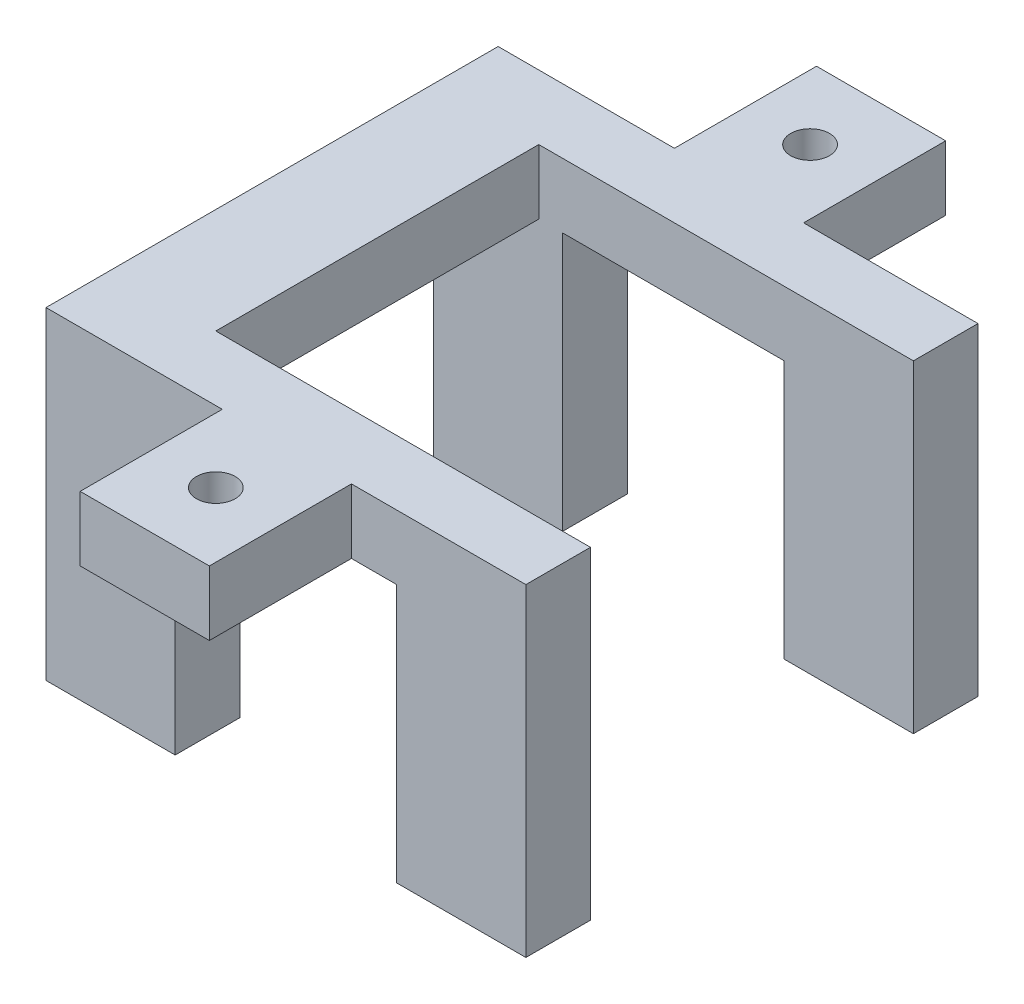
ISO-10303-21;
HEADER;
FILE_DESCRIPTION(('STEP AP214'),'2;1');
FILE_NAME('part.step','',(''),(''),'','','');
FILE_SCHEMA(('AUTOMOTIVE_DESIGN { 1 0 10303 214 1 1 1 1 }'));
ENDSEC;
DATA;
#1=APPLICATION_CONTEXT('core data for automotive mechanical design processes');
#2=APPLICATION_PROTOCOL_DEFINITION('international standard','automotive_design',2000,#1);
#3=PRODUCT_CONTEXT('',#1,'mechanical');
#4=PRODUCT('Part','Part','',(#3));
#5=PRODUCT_RELATED_PRODUCT_CATEGORY('part','',(#4));
#6=PRODUCT_DEFINITION_FORMATION('','',#4);
#7=PRODUCT_DEFINITION_CONTEXT('part definition',#1,'design');
#8=PRODUCT_DEFINITION('design','',#6,#7);
#9=PRODUCT_DEFINITION_SHAPE('','',#8);
#10=(LENGTH_UNIT() NAMED_UNIT(*) SI_UNIT(.MILLI.,.METRE.));
#11=(NAMED_UNIT(*) PLANE_ANGLE_UNIT() SI_UNIT($,.RADIAN.));
#12=(NAMED_UNIT(*) SI_UNIT($,.STERADIAN.) SOLID_ANGLE_UNIT());
#13=UNCERTAINTY_MEASURE_WITH_UNIT(LENGTH_MEASURE(1.E-05),#10,'distance_accuracy_value','');
#14=(GEOMETRIC_REPRESENTATION_CONTEXT(3) GLOBAL_UNCERTAINTY_ASSIGNED_CONTEXT((#13)) GLOBAL_UNIT_ASSIGNED_CONTEXT((#10,
#11,#12)) REPRESENTATION_CONTEXT('',''));
#15=CARTESIAN_POINT('',(0.,0.,0.));
#16=DIRECTION('',(0.,0.,1.));
#17=DIRECTION('',(1.,0.,0.));
#18=AXIS2_PLACEMENT_3D('',#15,#16,#17);
#19=CARTESIAN_POINT('',(0.,0.,0.));
#20=DIRECTION('',(0.,1.,0.));
#21=DIRECTION('',(0.,0.,1.));
#22=AXIS2_PLACEMENT_3D('',#19,#20,#21);
#23=PLANE('',#22);
#24=DIRECTION('',(1.,0.,0.));
#25=VECTOR('',#24,1.);
#26=CARTESIAN_POINT('',(0.,0.,12.5));
#27=LINE('',#26,#25);
#28=CARTESIAN_POINT('',(-2.6448064881758,0.,12.5));
#29=VERTEX_POINT('',#28);
#30=CARTESIAN_POINT('',(5.5,0.,12.5));
#31=VERTEX_POINT('',#30);
#32=EDGE_CURVE('E269',#29,#31,#27,.T.);
#33=ORIENTED_EDGE('',*,*,#32,.F.);
#34=DIRECTION('',(0.,0.,-1.));
#35=VECTOR('',#34,1.);
#36=CARTESIAN_POINT('',(-2.6448064881758,0.,17.5));
#37=LINE('',#36,#35);
#38=CARTESIAN_POINT('',(-2.6448064881758,0.,-12.5));
#39=VERTEX_POINT('',#38);
#40=EDGE_CURVE('E234',#29,#39,#37,.T.);
#41=ORIENTED_EDGE('',*,*,#40,.T.);
#42=DIRECTION('',(-1.,0.,0.));
#43=VECTOR('',#42,1.);
#44=CARTESIAN_POINT('',(0.,0.,-12.5));
#45=LINE('',#44,#43);
#46=CARTESIAN_POINT('',(5.5,0.,-12.5));
#47=VERTEX_POINT('',#46);
#48=EDGE_CURVE('E271',#47,#39,#45,.T.);
#49=ORIENTED_EDGE('',*,*,#48,.F.);
#50=DIRECTION('',(0.,0.,1.));
#51=VECTOR('',#50,1.);
#52=CARTESIAN_POINT('',(5.5,0.,-8.5));
#53=LINE('',#52,#51);
#54=EDGE_CURVE('E261',#47,#31,#53,.T.);
#55=ORIENTED_EDGE('',*,*,#54,.T.);
#56=EDGE_LOOP('',(#33,#41,#49,#55));
#57=FACE_BOUND('',#56,.T.);
#58=ADVANCED_FACE('F36',(#57),#23,.F.);
#59=CARTESIAN_POINT('',(16.,0.,-23.));
#60=DIRECTION('',(0.,1.,0.));
#61=DIRECTION('',(0.,0.,1.));
#62=AXIS2_PLACEMENT_3D('',#59,#60,#61);
#63=CIRCLE('',#62,1.5);
#64=CARTESIAN_POINT('',(16.,0.,-21.5));
#65=VERTEX_POINT('',#64);
#66=EDGE_CURVE('E316',#65,#65,#63,.T.);
#67=ORIENTED_EDGE('',*,*,#66,.T.);
#68=EDGE_LOOP('',(#67));
#69=FACE_BOUND('',#68,.T.);
#70=DIRECTION('',(0.,0.,1.));
#71=VECTOR('',#70,1.);
#72=CARTESIAN_POINT('',(7.3551935118242,0.,0.));
#73=LINE('',#72,#71);
#74=CARTESIAN_POINT('',(7.3551935118242,0.,-17.5));
#75=VERTEX_POINT('',#74);
#76=CARTESIAN_POINT('',(7.3551935118242,0.,-12.5));
#77=VERTEX_POINT('',#76);
#78=EDGE_CURVE('E454',#75,#77,#73,.T.);
#79=ORIENTED_EDGE('',*,*,#78,.F.);
#80=DIRECTION('',(-1.,0.,0.));
#81=VECTOR('',#80,1.);
#82=CARTESIAN_POINT('',(16.5,0.,-17.5));
#83=LINE('',#82,#81);
#84=CARTESIAN_POINT('',(11.,0.,-17.5));
#85=VERTEX_POINT('',#84);
#86=EDGE_CURVE('E363',#85,#75,#83,.T.);
#87=ORIENTED_EDGE('',*,*,#86,.F.);
#88=DIRECTION('',(0.,0.,1.));
#89=VECTOR('',#88,1.);
#90=CARTESIAN_POINT('',(11.,0.,-28.5));
#91=LINE('',#90,#89);
#92=CARTESIAN_POINT('',(11.,0.,-28.5));
#93=VERTEX_POINT('',#92);
#94=EDGE_CURVE('E341',#93,#85,#91,.T.);
#95=ORIENTED_EDGE('',*,*,#94,.F.);
#96=DIRECTION('',(-1.,0.,0.));
#97=VECTOR('',#96,1.);
#98=CARTESIAN_POINT('',(0.,0.,-28.5));
#99=LINE('',#98,#97);
#100=CARTESIAN_POINT('',(21.,0.,-28.5));
#101=VERTEX_POINT('',#100);
#102=EDGE_CURVE('E320',#101,#93,#99,.T.);
#103=ORIENTED_EDGE('',*,*,#102,.F.);
#104=DIRECTION('',(0.,0.,1.));
#105=VECTOR('',#104,1.);
#106=CARTESIAN_POINT('',(21.,0.,-28.5));
#107=LINE('',#106,#105);
#108=CARTESIAN_POINT('',(21.,0.,-17.5));
#109=VERTEX_POINT('',#108);
#110=EDGE_CURVE('E330',#101,#109,#107,.T.);
#111=ORIENTED_EDGE('',*,*,#110,.T.);
#112=DIRECTION('',(-1.,0.,0.));
#113=VECTOR('',#112,1.);
#114=CARTESIAN_POINT('',(0.,0.,-17.5));
#115=LINE('',#114,#113);
#116=CARTESIAN_POINT('',(24.5,0.,-17.5));
#117=VERTEX_POINT('',#116);
#118=EDGE_CURVE('E304',#117,#109,#115,.T.);
#119=ORIENTED_EDGE('',*,*,#118,.F.);
#120=DIRECTION('',(0.,0.,1.));
#121=VECTOR('',#120,1.);
#122=CARTESIAN_POINT('',(24.5,0.,-19.5));
#123=LINE('',#122,#121);
#124=CARTESIAN_POINT('',(24.5,0.,-12.5));
#125=VERTEX_POINT('',#124);
#126=EDGE_CURVE('E310',#117,#125,#123,.T.);
#127=ORIENTED_EDGE('',*,*,#126,.T.);
#128=DIRECTION('',(1.,0.,0.));
#129=VECTOR('',#128,1.);
#130=CARTESIAN_POINT('',(5.5,0.,-12.5));
#131=LINE('',#130,#129);
#132=EDGE_CURVE('E349',#77,#125,#131,.T.);
#133=ORIENTED_EDGE('',*,*,#132,.F.);
#134=EDGE_LOOP('',(#79,#87,#95,#103,#111,#119,#127,#133));
#135=FACE_BOUND('',#134,.T.);
#136=ADVANCED_FACE('F421',(#69,#135),#23,.F.);
#137=CARTESIAN_POINT('',(0.,0.,-17.5));
#138=DIRECTION('',(0.,0.,-1.));
#139=DIRECTION('',(-1.,0.,0.));
#140=AXIS2_PLACEMENT_3D('',#137,#138,#139);
#141=PLANE('',#140);
#142=DIRECTION('',(0.,1.,0.));
#143=VECTOR('',#142,1.);
#144=CARTESIAN_POINT('',(24.5,0.,-17.5));
#145=LINE('',#144,#143);
#146=CARTESIAN_POINT('',(24.5,-20.,-17.5));
#147=VERTEX_POINT('',#146);
#148=EDGE_CURVE('E303',#147,#117,#145,.T.);
#149=ORIENTED_EDGE('',*,*,#148,.T.);
#150=ORIENTED_EDGE('',*,*,#118,.T.);
#151=DIRECTION('',(0.,-1.,0.));
#152=VECTOR('',#151,1.);
#153=CARTESIAN_POINT('',(21.,0.,-17.5));
#154=LINE('',#153,#152);
#155=CARTESIAN_POINT('',(21.,5.,-17.5));
#156=VERTEX_POINT('',#155);
#157=EDGE_CURVE('E324',#156,#109,#154,.T.);
#158=ORIENTED_EDGE('',*,*,#157,.F.);
#159=DIRECTION('',(1.,0.,0.));
#160=VECTOR('',#159,1.);
#161=CARTESIAN_POINT('',(-5.5,5.,-17.5));
#162=LINE('',#161,#160);
#163=CARTESIAN_POINT('',(34.5,5.,-17.5));
#164=VERTEX_POINT('',#163);
#165=EDGE_CURVE('E355',#156,#164,#162,.T.);
#166=ORIENTED_EDGE('',*,*,#165,.T.);
#167=DIRECTION('',(0.,-1.,0.));
#168=VECTOR('',#167,1.);
#169=CARTESIAN_POINT('',(34.5,5.,-17.5));
#170=LINE('',#169,#168);
#171=CARTESIAN_POINT('',(34.5,-20.,-17.5));
#172=VERTEX_POINT('',#171);
#173=EDGE_CURVE('E357',#164,#172,#170,.T.);
#174=ORIENTED_EDGE('',*,*,#173,.T.);
#175=DIRECTION('',(-1.,0.,0.));
#176=VECTOR('',#175,1.);
#177=CARTESIAN_POINT('',(34.5,-20.,-17.5));
#178=LINE('',#177,#176);
#179=EDGE_CURVE('E360',#172,#147,#178,.T.);
#180=ORIENTED_EDGE('',*,*,#179,.T.);
#181=EDGE_LOOP('',(#149,#150,#158,#166,#174,#180));
#182=FACE_BOUND('',#181,.T.);
#183=ADVANCED_FACE('F427',(#182),#141,.T.);
#184=CARTESIAN_POINT('',(0.,-20.,0.));
#185=DIRECTION('',(0.,-1.,0.));
#186=DIRECTION('',(0.,0.,-1.));
#187=AXIS2_PLACEMENT_3D('',#184,#185,#186);
#188=PLANE('',#187);
#189=DIRECTION('',(1.,0.,0.));
#190=VECTOR('',#189,1.);
#191=CARTESIAN_POINT('',(16.5,-20.,-12.5));
#192=LINE('',#191,#190);
#193=CARTESIAN_POINT('',(24.5,-20.,-12.5));
#194=VERTEX_POINT('',#193);
#195=CARTESIAN_POINT('',(34.5,-20.,-12.5));
#196=VERTEX_POINT('',#195);
#197=EDGE_CURVE('E351',#194,#196,#192,.T.);
#198=ORIENTED_EDGE('',*,*,#197,.F.);
#199=DIRECTION('',(0.,0.,1.));
#200=VECTOR('',#199,1.);
#201=CARTESIAN_POINT('',(24.5,-20.,-19.5));
#202=LINE('',#201,#200);
#203=EDGE_CURVE('E410',#147,#194,#202,.T.);
#204=ORIENTED_EDGE('',*,*,#203,.F.);
#205=ORIENTED_EDGE('',*,*,#179,.F.);
#206=DIRECTION('',(0.,0.,-1.));
#207=VECTOR('',#206,1.);
#208=CARTESIAN_POINT('',(34.5,-20.,-8.5));
#209=LINE('',#208,#207);
#210=EDGE_CURVE('E254',#196,#172,#209,.T.);
#211=ORIENTED_EDGE('',*,*,#210,.F.);
#212=EDGE_LOOP('',(#198,#204,#205,#211));
#213=FACE_BOUND('',#212,.T.);
#214=ADVANCED_FACE('F433',(#213),#188,.T.);
#215=CARTESIAN_POINT('',(0.,-20.,0.));
#216=DIRECTION('',(0.,-1.,0.));
#217=DIRECTION('',(0.,0.,-1.));
#218=AXIS2_PLACEMENT_3D('',#215,#216,#217);
#219=PLANE('',#218);
#220=DIRECTION('',(1.,0.,0.));
#221=VECTOR('',#220,1.);
#222=CARTESIAN_POINT('',(16.5,-20.,17.5));
#223=LINE('',#222,#221);
#224=CARTESIAN_POINT('',(24.5,-20.,17.5));
#225=VERTEX_POINT('',#224);
#226=CARTESIAN_POINT('',(34.5,-20.,17.5));
#227=VERTEX_POINT('',#226);
#228=EDGE_CURVE('E248',#225,#227,#223,.T.);
#229=ORIENTED_EDGE('',*,*,#228,.F.);
#230=CARTESIAN_POINT('',(24.5,-20.,12.5));
#231=VERTEX_POINT('',#230);
#232=EDGE_CURVE('E408',#231,#225,#202,.T.);
#233=ORIENTED_EDGE('',*,*,#232,.F.);
#234=DIRECTION('',(-1.,0.,0.));
#235=VECTOR('',#234,1.);
#236=CARTESIAN_POINT('',(34.5,-20.,12.5));
#237=LINE('',#236,#235);
#238=CARTESIAN_POINT('',(34.5,-20.,12.5));
#239=VERTEX_POINT('',#238);
#240=EDGE_CURVE('E288',#239,#231,#237,.T.);
#241=ORIENTED_EDGE('',*,*,#240,.F.);
#242=DIRECTION('',(0.,0.,1.));
#243=VECTOR('',#242,1.);
#244=CARTESIAN_POINT('',(34.5,-20.,8.5));
#245=LINE('',#244,#243);
#246=EDGE_CURVE('E256',#239,#227,#245,.T.);
#247=ORIENTED_EDGE('',*,*,#246,.T.);
#248=EDGE_LOOP('',(#229,#233,#241,#247));
#249=FACE_BOUND('',#248,.T.);
#250=ADVANCED_FACE('F407',(#249),#219,.T.);
#251=CARTESIAN_POINT('',(0.,0.,17.5));
#252=DIRECTION('',(0.,0.,1.));
#253=DIRECTION('',(1.,0.,0.));
#254=AXIS2_PLACEMENT_3D('',#251,#252,#253);
#255=PLANE('',#254);
#256=DIRECTION('',(0.,1.,0.));
#257=VECTOR('',#256,1.);
#258=CARTESIAN_POINT('',(21.,0.,17.5));
#259=LINE('',#258,#257);
#260=CARTESIAN_POINT('',(21.,0.,17.5));
#261=VERTEX_POINT('',#260);
#262=CARTESIAN_POINT('',(21.,5.,17.5));
#263=VERTEX_POINT('',#262);
#264=EDGE_CURVE('E372',#261,#263,#259,.T.);
#265=ORIENTED_EDGE('',*,*,#264,.F.);
#266=DIRECTION('',(1.,0.,0.));
#267=VECTOR('',#266,1.);
#268=CARTESIAN_POINT('',(16.5,0.,17.5));
#269=LINE('',#268,#267);
#270=CARTESIAN_POINT('',(24.5,0.,17.5));
#271=VERTEX_POINT('',#270);
#272=EDGE_CURVE('E400',#261,#271,#269,.T.);
#273=ORIENTED_EDGE('',*,*,#272,.T.);
#274=DIRECTION('',(0.,-1.,0.));
#275=VECTOR('',#274,1.);
#276=CARTESIAN_POINT('',(24.5,0.,17.5));
#277=LINE('',#276,#275);
#278=EDGE_CURVE('E411',#271,#225,#277,.T.);
#279=ORIENTED_EDGE('',*,*,#278,.T.);
#280=ORIENTED_EDGE('',*,*,#228,.T.);
#281=DIRECTION('',(0.,1.,0.));
#282=VECTOR('',#281,1.);
#283=CARTESIAN_POINT('',(34.5,-20.,17.5));
#284=LINE('',#283,#282);
#285=CARTESIAN_POINT('',(34.5,5.,17.5));
#286=VERTEX_POINT('',#285);
#287=EDGE_CURVE('E250',#227,#286,#284,.T.);
#288=ORIENTED_EDGE('',*,*,#287,.T.);
#289=DIRECTION('',(-1.,0.,0.));
#290=VECTOR('',#289,1.);
#291=CARTESIAN_POINT('',(34.5,5.,17.5));
#292=LINE('',#291,#290);
#293=EDGE_CURVE('E239',#286,#263,#292,.T.);
#294=ORIENTED_EDGE('',*,*,#293,.T.);
#295=EDGE_LOOP('',(#265,#273,#279,#280,#288,#294));
#296=FACE_BOUND('',#295,.T.);
#297=ADVANCED_FACE('F398',(#296),#255,.T.);
#298=CARTESIAN_POINT('',(0.,0.,12.5));
#299=DIRECTION('',(0.,0.,-1.));
#300=DIRECTION('',(-1.,0.,0.));
#301=AXIS2_PLACEMENT_3D('',#298,#299,#300);
#302=PLANE('',#301);
#303=DIRECTION('',(0.,1.,0.));
#304=VECTOR('',#303,1.);
#305=CARTESIAN_POINT('',(24.5,0.,12.5));
#306=LINE('',#305,#304);
#307=CARTESIAN_POINT('',(24.5,0.,12.5));
#308=VERTEX_POINT('',#307);
#309=EDGE_CURVE('E299',#231,#308,#306,.T.);
#310=ORIENTED_EDGE('',*,*,#309,.T.);
#311=DIRECTION('',(-1.,0.,0.));
#312=VECTOR('',#311,1.);
#313=CARTESIAN_POINT('',(16.5,0.,12.5));
#314=LINE('',#313,#312);
#315=CARTESIAN_POINT('',(7.3551935118242,0.,12.5));
#316=VERTEX_POINT('',#315);
#317=EDGE_CURVE('E58',#308,#316,#314,.T.);
#318=ORIENTED_EDGE('',*,*,#317,.T.);
#319=DIRECTION('',(0.,1.,0.));
#320=VECTOR('',#319,1.);
#321=CARTESIAN_POINT('',(7.3551935118242,-20.,12.5));
#322=LINE('',#321,#320);
#323=CARTESIAN_POINT('',(7.3551935118242,-20.,12.5));
#324=VERTEX_POINT('',#323);
#325=EDGE_CURVE('E297',#324,#316,#322,.T.);
#326=ORIENTED_EDGE('',*,*,#325,.F.);
#327=DIRECTION('',(1.,0.,0.));
#328=VECTOR('',#327,1.);
#329=CARTESIAN_POINT('',(0.,-20.,12.5));
#330=LINE('',#329,#328);
#331=CARTESIAN_POINT('',(-2.6448064881758,-20.,12.5));
#332=VERTEX_POINT('',#331);
#333=EDGE_CURVE('E462',#332,#324,#330,.T.);
#334=ORIENTED_EDGE('',*,*,#333,.F.);
#335=DIRECTION('',(0.,1.,0.));
#336=VECTOR('',#335,1.);
#337=CARTESIAN_POINT('',(-2.6448064881758,-20.,12.5));
#338=LINE('',#337,#336);
#339=EDGE_CURVE('E471',#332,#29,#338,.T.);
#340=ORIENTED_EDGE('',*,*,#339,.T.);
#341=ORIENTED_EDGE('',*,*,#32,.T.);
#342=DIRECTION('',(0.,1.,0.));
#343=VECTOR('',#342,1.);
#344=CARTESIAN_POINT('',(5.5,0.,12.5));
#345=LINE('',#344,#343);
#346=CARTESIAN_POINT('',(5.5,5.,12.5));
#347=VERTEX_POINT('',#346);
#348=EDGE_CURVE('E240',#31,#347,#345,.T.);
#349=ORIENTED_EDGE('',*,*,#348,.T.);
#350=DIRECTION('',(1.,0.,0.));
#351=VECTOR('',#350,1.);
#352=CARTESIAN_POINT('',(5.5,5.,12.5));
#353=LINE('',#352,#351);
#354=CARTESIAN_POINT('',(34.5,5.,12.5));
#355=VERTEX_POINT('',#354);
#356=EDGE_CURVE('E279',#347,#355,#353,.T.);
#357=ORIENTED_EDGE('',*,*,#356,.T.);
#358=DIRECTION('',(0.,-1.,0.));
#359=VECTOR('',#358,1.);
#360=CARTESIAN_POINT('',(34.5,5.,12.5));
#361=LINE('',#360,#359);
#362=EDGE_CURVE('E285',#355,#239,#361,.T.);
#363=ORIENTED_EDGE('',*,*,#362,.T.);
#364=ORIENTED_EDGE('',*,*,#240,.T.);
#365=EDGE_LOOP('',(#310,#318,#326,#334,#340,#341,#349,#357,#363,#364));
#366=FACE_BOUND('',#365,.T.);
#367=ADVANCED_FACE('F278',(#366),#302,.T.);
#368=CARTESIAN_POINT('',(0.,0.,-12.5));
#369=DIRECTION('',(0.,0.,1.));
#370=DIRECTION('',(1.,0.,0.));
#371=AXIS2_PLACEMENT_3D('',#368,#369,#370);
#372=PLANE('',#371);
#373=DIRECTION('',(0.,-1.,0.));
#374=VECTOR('',#373,1.);
#375=CARTESIAN_POINT('',(5.5,5.,-12.5));
#376=LINE('',#375,#374);
#377=CARTESIAN_POINT('',(5.5,5.,-12.5));
#378=VERTEX_POINT('',#377);
#379=EDGE_CURVE('E347',#378,#47,#376,.T.);
#380=ORIENTED_EDGE('',*,*,#379,.T.);
#381=ORIENTED_EDGE('',*,*,#48,.T.);
#382=DIRECTION('',(0.,1.,0.));
#383=VECTOR('',#382,1.);
#384=CARTESIAN_POINT('',(-2.6448064881758,-20.,-12.5));
#385=LINE('',#384,#383);
#386=CARTESIAN_POINT('',(-2.6448064881758,-20.,-12.5));
#387=VERTEX_POINT('',#386);
#388=EDGE_CURVE('E458',#387,#39,#385,.T.);
#389=ORIENTED_EDGE('',*,*,#388,.F.);
#390=DIRECTION('',(-1.,0.,0.));
#391=VECTOR('',#390,1.);
#392=CARTESIAN_POINT('',(0.,-20.,-12.5));
#393=LINE('',#392,#391);
#394=CARTESIAN_POINT('',(7.3551935118242,-20.,-12.5));
#395=VERTEX_POINT('',#394);
#396=EDGE_CURVE('E443',#395,#387,#393,.T.);
#397=ORIENTED_EDGE('',*,*,#396,.F.);
#398=DIRECTION('',(0.,1.,0.));
#399=VECTOR('',#398,1.);
#400=CARTESIAN_POINT('',(7.3551935118242,-20.,-12.5));
#401=LINE('',#400,#399);
#402=EDGE_CURVE('E440',#395,#77,#401,.T.);
#403=ORIENTED_EDGE('',*,*,#402,.T.);
#404=ORIENTED_EDGE('',*,*,#132,.T.);
#405=DIRECTION('',(0.,-1.,0.));
#406=VECTOR('',#405,1.);
#407=CARTESIAN_POINT('',(24.5,0.,-12.5));
#408=LINE('',#407,#406);
#409=EDGE_CURVE('E11',#125,#194,#408,.T.);
#410=ORIENTED_EDGE('',*,*,#409,.T.);
#411=ORIENTED_EDGE('',*,*,#197,.T.);
#412=DIRECTION('',(0.,1.,0.));
#413=VECTOR('',#412,1.);
#414=CARTESIAN_POINT('',(34.5,-20.,-12.5));
#415=LINE('',#414,#413);
#416=CARTESIAN_POINT('',(34.5,5.,-12.5));
#417=VERTEX_POINT('',#416);
#418=EDGE_CURVE('E353',#196,#417,#415,.T.);
#419=ORIENTED_EDGE('',*,*,#418,.T.);
#420=DIRECTION('',(-1.,0.,0.));
#421=VECTOR('',#420,1.);
#422=CARTESIAN_POINT('',(34.5,5.,-12.5));
#423=LINE('',#422,#421);
#424=EDGE_CURVE('E344',#417,#378,#423,.T.);
#425=ORIENTED_EDGE('',*,*,#424,.T.);
#426=EDGE_LOOP('',(#380,#381,#389,#397,#403,#404,#410,#411,#419,#425));
#427=FACE_BOUND('',#426,.T.);
#428=ADVANCED_FACE('F435',(#427),#372,.T.);
#429=CARTESIAN_POINT('',(34.5,-20.,-8.5));
#430=DIRECTION('',(1.,0.,0.));
#431=DIRECTION('',(0.,0.,-1.));
#432=AXIS2_PLACEMENT_3D('',#429,#430,#431);
#433=PLANE('',#432);
#434=DIRECTION('',(0.,0.,-1.));
#435=VECTOR('',#434,1.);
#436=CARTESIAN_POINT('',(34.5,5.,-8.5));
#437=LINE('',#436,#435);
#438=EDGE_CURVE('E253',#417,#164,#437,.T.);
#439=ORIENTED_EDGE('',*,*,#438,.F.);
#440=ORIENTED_EDGE('',*,*,#418,.F.);
#441=ORIENTED_EDGE('',*,*,#210,.T.);
#442=ORIENTED_EDGE('',*,*,#173,.F.);
#443=EDGE_LOOP('',(#439,#440,#441,#442));
#444=FACE_BOUND('',#443,.T.);
#445=ADVANCED_FACE('F538',(#444),#433,.T.);
#446=CARTESIAN_POINT('',(11.,5.,17.5));
#447=VERTEX_POINT('',#446);
#448=CARTESIAN_POINT('',(-2.6448064881758,5.,17.5));
#449=VERTEX_POINT('',#448);
#450=EDGE_CURVE('E230',#447,#449,#292,.T.);
#451=ORIENTED_EDGE('',*,*,#450,.T.);
#452=DIRECTION('',(0.,1.,0.));
#453=VECTOR('',#452,1.);
#454=CARTESIAN_POINT('',(-2.6448064881758,-20.,17.5));
#455=LINE('',#454,#453);
#456=CARTESIAN_POINT('',(-2.6448064881758,-20.,17.5));
#457=VERTEX_POINT('',#456);
#458=EDGE_CURVE('E210',#457,#449,#455,.T.);
#459=ORIENTED_EDGE('',*,*,#458,.F.);
#460=DIRECTION('',(-1.,0.,0.));
#461=VECTOR('',#460,1.);
#462=CARTESIAN_POINT('',(0.,-20.,17.5));
#463=LINE('',#462,#461);
#464=CARTESIAN_POINT('',(7.3551935118242,-20.,17.5));
#465=VERTEX_POINT('',#464);
#466=EDGE_CURVE('E223',#465,#457,#463,.T.);
#467=ORIENTED_EDGE('',*,*,#466,.F.);
#468=DIRECTION('',(0.,1.,0.));
#469=VECTOR('',#468,1.);
#470=CARTESIAN_POINT('',(7.3551935118242,-20.,17.5));
#471=LINE('',#470,#469);
#472=CARTESIAN_POINT('',(7.35519351182419,0.,17.5));
#473=VERTEX_POINT('',#472);
#474=EDGE_CURVE('E222',#465,#473,#471,.T.);
#475=ORIENTED_EDGE('',*,*,#474,.T.);
#476=DIRECTION('',(1.,0.,0.));
#477=VECTOR('',#476,1.);
#478=CARTESIAN_POINT('',(-5.5,0.,17.5));
#479=LINE('',#478,#477);
#480=CARTESIAN_POINT('',(11.,0.,17.5));
#481=VERTEX_POINT('',#480);
#482=EDGE_CURVE('E242',#473,#481,#479,.T.);
#483=ORIENTED_EDGE('',*,*,#482,.T.);
#484=DIRECTION('',(0.,-1.,0.));
#485=VECTOR('',#484,1.);
#486=CARTESIAN_POINT('',(11.,0.,17.5));
#487=LINE('',#486,#485);
#488=EDGE_CURVE('E238',#447,#481,#487,.T.);
#489=ORIENTED_EDGE('',*,*,#488,.F.);
#490=EDGE_LOOP('',(#451,#459,#467,#475,#483,#489));
#491=FACE_BOUND('',#490,.T.);
#492=ADVANCED_FACE('F236',(#491),#255,.T.);
#493=CARTESIAN_POINT('',(34.5,-20.,8.5));
#494=DIRECTION('',(1.,0.,0.));
#495=DIRECTION('',(0.,0.,-1.));
#496=AXIS2_PLACEMENT_3D('',#493,#494,#495);
#497=PLANE('',#496);
#498=ORIENTED_EDGE('',*,*,#246,.F.);
#499=ORIENTED_EDGE('',*,*,#362,.F.);
#500=DIRECTION('',(0.,0.,1.));
#501=VECTOR('',#500,1.);
#502=CARTESIAN_POINT('',(34.5,5.,8.5));
#503=LINE('',#502,#501);
#504=EDGE_CURVE('E259',#355,#286,#503,.T.);
#505=ORIENTED_EDGE('',*,*,#504,.T.);
#506=ORIENTED_EDGE('',*,*,#287,.F.);
#507=EDGE_LOOP('',(#498,#499,#505,#506));
#508=FACE_BOUND('',#507,.T.);
#509=ADVANCED_FACE('F405',(#508),#497,.T.);
#510=ORIENTED_EDGE('',*,*,#482,.F.);
#511=DIRECTION('',(0.,0.,-1.));
#512=VECTOR('',#511,1.);
#513=CARTESIAN_POINT('',(7.3551935118242,0.,0.));
#514=LINE('',#513,#512);
#515=EDGE_CURVE('E51',#473,#316,#514,.T.);
#516=ORIENTED_EDGE('',*,*,#515,.T.);
#517=ORIENTED_EDGE('',*,*,#317,.F.);
#518=EDGE_CURVE('E413',#308,#271,#123,.T.);
#519=ORIENTED_EDGE('',*,*,#518,.T.);
#520=ORIENTED_EDGE('',*,*,#272,.F.);
#521=DIRECTION('',(0.,0.,-1.));
#522=VECTOR('',#521,1.);
#523=CARTESIAN_POINT('',(21.,0.,28.5));
#524=LINE('',#523,#522);
#525=CARTESIAN_POINT('',(21.,0.,28.5));
#526=VERTEX_POINT('',#525);
#527=EDGE_CURVE('E286',#526,#261,#524,.T.);
#528=ORIENTED_EDGE('',*,*,#527,.F.);
#529=DIRECTION('',(1.,0.,0.));
#530=VECTOR('',#529,1.);
#531=CARTESIAN_POINT('',(0.,0.,28.5));
#532=LINE('',#531,#530);
#533=CARTESIAN_POINT('',(11.,0.,28.5));
#534=VERTEX_POINT('',#533);
#535=EDGE_CURVE('E373',#534,#526,#532,.T.);
#536=ORIENTED_EDGE('',*,*,#535,.F.);
#537=DIRECTION('',(0.,0.,-1.));
#538=VECTOR('',#537,1.);
#539=CARTESIAN_POINT('',(11.,0.,28.5));
#540=LINE('',#539,#538);
#541=EDGE_CURVE('E382',#534,#481,#540,.T.);
#542=ORIENTED_EDGE('',*,*,#541,.T.);
#543=EDGE_LOOP('',(#510,#516,#517,#519,#520,#528,#536,#542));
#544=FACE_BOUND('',#543,.T.);
#545=CARTESIAN_POINT('',(16.,0.,23.));
#546=DIRECTION('',(0.,1.,0.));
#547=DIRECTION('',(0.,0.,1.));
#548=AXIS2_PLACEMENT_3D('',#545,#546,#547);
#549=CIRCLE('',#548,1.5);
#550=CARTESIAN_POINT('',(16.,0.,24.5));
#551=VERTEX_POINT('',#550);
#552=EDGE_CURVE('E369',#551,#551,#549,.T.);
#553=ORIENTED_EDGE('',*,*,#552,.T.);
#554=EDGE_LOOP('',(#553));
#555=FACE_BOUND('',#554,.T.);
#556=ADVANCED_FACE('F497',(#544,#555),#23,.F.);
#557=CARTESIAN_POINT('',(5.5,5.,-8.5));
#558=DIRECTION('',(1.,0.,0.));
#559=DIRECTION('',(0.,0.,-1.));
#560=AXIS2_PLACEMENT_3D('',#557,#558,#559);
#561=PLANE('',#560);
#562=ORIENTED_EDGE('',*,*,#54,.F.);
#563=ORIENTED_EDGE('',*,*,#379,.F.);
#564=DIRECTION('',(0.,0.,-1.));
#565=VECTOR('',#564,1.);
#566=CARTESIAN_POINT('',(5.5,5.,8.5));
#567=LINE('',#566,#565);
#568=EDGE_CURVE('E44',#347,#378,#567,.T.);
#569=ORIENTED_EDGE('',*,*,#568,.F.);
#570=ORIENTED_EDGE('',*,*,#348,.F.);
#571=EDGE_LOOP('',(#562,#563,#569,#570));
#572=FACE_BOUND('',#571,.T.);
#573=ADVANCED_FACE('F38',(#572),#561,.T.);
#574=CARTESIAN_POINT('',(0.,5.,0.));
#575=DIRECTION('',(0.,1.,0.));
#576=DIRECTION('',(0.,0.,1.));
#577=AXIS2_PLACEMENT_3D('',#574,#575,#576);
#578=PLANE('',#577);
#579=DIRECTION('',(0.,0.,-1.));
#580=VECTOR('',#579,1.);
#581=CARTESIAN_POINT('',(-2.6448064881758,5.,17.5));
#582=LINE('',#581,#580);
#583=CARTESIAN_POINT('',(-2.6448064881758,5.,-17.5));
#584=VERTEX_POINT('',#583);
#585=EDGE_CURVE('E214',#449,#584,#582,.T.);
#586=ORIENTED_EDGE('',*,*,#585,.F.);
#587=ORIENTED_EDGE('',*,*,#450,.F.);
#588=DIRECTION('',(0.,0.,-1.));
#589=VECTOR('',#588,1.);
#590=CARTESIAN_POINT('',(11.,5.,28.5));
#591=LINE('',#590,#589);
#592=CARTESIAN_POINT('',(11.,5.,28.5));
#593=VERTEX_POINT('',#592);
#594=EDGE_CURVE('E388',#593,#447,#591,.T.);
#595=ORIENTED_EDGE('',*,*,#594,.F.);
#596=DIRECTION('',(-1.,0.,0.));
#597=VECTOR('',#596,1.);
#598=CARTESIAN_POINT('',(0.,5.,28.5));
#599=LINE('',#598,#597);
#600=CARTESIAN_POINT('',(21.,5.,28.5));
#601=VERTEX_POINT('',#600);
#602=EDGE_CURVE('E378',#601,#593,#599,.T.);
#603=ORIENTED_EDGE('',*,*,#602,.F.);
#604=DIRECTION('',(0.,0.,-1.));
#605=VECTOR('',#604,1.);
#606=CARTESIAN_POINT('',(21.,5.,28.5));
#607=LINE('',#606,#605);
#608=EDGE_CURVE('E291',#601,#263,#607,.T.);
#609=ORIENTED_EDGE('',*,*,#608,.T.);
#610=ORIENTED_EDGE('',*,*,#293,.F.);
#611=ORIENTED_EDGE('',*,*,#504,.F.);
#612=ORIENTED_EDGE('',*,*,#356,.F.);
#613=ORIENTED_EDGE('',*,*,#568,.T.);
#614=ORIENTED_EDGE('',*,*,#424,.F.);
#615=ORIENTED_EDGE('',*,*,#438,.T.);
#616=ORIENTED_EDGE('',*,*,#165,.F.);
#617=DIRECTION('',(0.,0.,1.));
#618=VECTOR('',#617,1.);
#619=CARTESIAN_POINT('',(21.,5.,-28.5));
#620=LINE('',#619,#618);
#621=CARTESIAN_POINT('',(21.,5.,-28.5));
#622=VERTEX_POINT('',#621);
#623=EDGE_CURVE('E336',#622,#156,#620,.T.);
#624=ORIENTED_EDGE('',*,*,#623,.F.);
#625=DIRECTION('',(1.,0.,0.));
#626=VECTOR('',#625,1.);
#627=CARTESIAN_POINT('',(0.,5.,-28.5));
#628=LINE('',#627,#626);
#629=CARTESIAN_POINT('',(11.,5.,-28.5));
#630=VERTEX_POINT('',#629);
#631=EDGE_CURVE('E326',#630,#622,#628,.T.);
#632=ORIENTED_EDGE('',*,*,#631,.F.);
#633=DIRECTION('',(0.,0.,1.));
#634=VECTOR('',#633,1.);
#635=CARTESIAN_POINT('',(11.,5.,-28.5));
#636=LINE('',#635,#634);
#637=CARTESIAN_POINT('',(11.,5.,-17.5));
#638=VERTEX_POINT('',#637);
#639=EDGE_CURVE('E339',#630,#638,#636,.T.);
#640=ORIENTED_EDGE('',*,*,#639,.T.);
#641=EDGE_CURVE('E233',#584,#638,#162,.T.);
#642=ORIENTED_EDGE('',*,*,#641,.F.);
#643=EDGE_LOOP('',(#586,#587,#595,#603,#609,#610,#611,#612,#613,#614,#615,#616,#624,#632,#640,#642));
#644=FACE_BOUND('',#643,.T.);
#645=CARTESIAN_POINT('',(16.,5.,-23.));
#646=DIRECTION('',(0.,1.,0.));
#647=DIRECTION('',(0.,0.,1.));
#648=AXIS2_PLACEMENT_3D('',#645,#646,#647);
#649=CIRCLE('',#648,1.5);
#650=CARTESIAN_POINT('',(16.,5.,-21.5));
#651=VERTEX_POINT('',#650);
#652=EDGE_CURVE('E307',#651,#651,#649,.T.);
#653=ORIENTED_EDGE('',*,*,#652,.F.);
#654=EDGE_LOOP('',(#653));
#655=FACE_BOUND('',#654,.T.);
#656=CARTESIAN_POINT('',(16.,5.,23.));
#657=DIRECTION('',(0.,1.,0.));
#658=DIRECTION('',(0.,0.,1.));
#659=AXIS2_PLACEMENT_3D('',#656,#657,#658);
#660=CIRCLE('',#659,1.5);
#661=CARTESIAN_POINT('',(16.,5.,24.5));
#662=VERTEX_POINT('',#661);
#663=EDGE_CURVE('E366',#662,#662,#660,.T.);
#664=ORIENTED_EDGE('',*,*,#663,.F.);
#665=EDGE_LOOP('',(#664));
#666=FACE_BOUND('',#665,.T.);
#667=ADVANCED_FACE('F227',(#644,#655,#666),#578,.T.);
#668=CARTESIAN_POINT('',(21.,0.,28.5));
#669=DIRECTION('',(-1.,0.,0.));
#670=DIRECTION('',(0.,0.,1.));
#671=AXIS2_PLACEMENT_3D('',#668,#669,#670);
#672=PLANE('',#671);
#673=ORIENTED_EDGE('',*,*,#264,.T.);
#674=ORIENTED_EDGE('',*,*,#608,.F.);
#675=DIRECTION('',(0.,1.,0.));
#676=VECTOR('',#675,1.);
#677=CARTESIAN_POINT('',(21.,0.,28.5));
#678=LINE('',#677,#676);
#679=EDGE_CURVE('E376',#526,#601,#678,.T.);
#680=ORIENTED_EDGE('',*,*,#679,.F.);
#681=ORIENTED_EDGE('',*,*,#527,.T.);
#682=EDGE_LOOP('',(#673,#674,#680,#681));
#683=FACE_BOUND('',#682,.T.);
#684=ADVANCED_FACE('F393',(#683),#672,.F.);
#685=CARTESIAN_POINT('',(11.,0.,28.5));
#686=DIRECTION('',(1.,0.,0.));
#687=DIRECTION('',(0.,0.,-1.));
#688=AXIS2_PLACEMENT_3D('',#685,#686,#687);
#689=PLANE('',#688);
#690=ORIENTED_EDGE('',*,*,#488,.T.);
#691=ORIENTED_EDGE('',*,*,#541,.F.);
#692=DIRECTION('',(0.,-1.,0.));
#693=VECTOR('',#692,1.);
#694=CARTESIAN_POINT('',(11.,0.,28.5));
#695=LINE('',#694,#693);
#696=EDGE_CURVE('E380',#593,#534,#695,.T.);
#697=ORIENTED_EDGE('',*,*,#696,.F.);
#698=ORIENTED_EDGE('',*,*,#594,.T.);
#699=EDGE_LOOP('',(#690,#691,#697,#698));
#700=FACE_BOUND('',#699,.T.);
#701=ADVANCED_FACE('F524',(#700),#689,.F.);
#702=CARTESIAN_POINT('',(0.,0.,28.5));
#703=DIRECTION('',(0.,0.,1.));
#704=DIRECTION('',(1.,0.,0.));
#705=AXIS2_PLACEMENT_3D('',#702,#703,#704);
#706=PLANE('',#705);
#707=ORIENTED_EDGE('',*,*,#535,.T.);
#708=ORIENTED_EDGE('',*,*,#679,.T.);
#709=ORIENTED_EDGE('',*,*,#602,.T.);
#710=ORIENTED_EDGE('',*,*,#696,.T.);
#711=EDGE_LOOP('',(#707,#708,#709,#710));
#712=FACE_BOUND('',#711,.T.);
#713=ADVANCED_FACE('F515',(#712),#706,.T.);
#714=CARTESIAN_POINT('',(16.,-5.,23.));
#715=DIRECTION('',(0.,1.,0.));
#716=DIRECTION('',(0.,0.,1.));
#717=AXIS2_PLACEMENT_3D('',#714,#715,#716);
#718=CYLINDRICAL_SURFACE('',#717,1.5);
#719=ORIENTED_EDGE('',*,*,#663,.T.);
#720=EDGE_LOOP('',(#719));
#721=FACE_BOUND('',#720,.T.);
#722=ORIENTED_EDGE('',*,*,#552,.F.);
#723=EDGE_LOOP('',(#722));
#724=FACE_BOUND('',#723,.T.);
#725=ADVANCED_FACE('F513',(#721,#724),#718,.F.);
#726=DIRECTION('',(0.,1.,0.));
#727=VECTOR('',#726,1.);
#728=CARTESIAN_POINT('',(-2.6448064881758,-20.,-17.5));
#729=LINE('',#728,#727);
#730=CARTESIAN_POINT('',(-2.6448064881758,-20.,-17.5));
#731=VERTEX_POINT('',#730);
#732=EDGE_CURVE('E449',#731,#584,#729,.T.);
#733=ORIENTED_EDGE('',*,*,#732,.T.);
#734=ORIENTED_EDGE('',*,*,#641,.T.);
#735=DIRECTION('',(0.,1.,0.));
#736=VECTOR('',#735,1.);
#737=CARTESIAN_POINT('',(11.,0.,-17.5));
#738=LINE('',#737,#736);
#739=EDGE_CURVE('E319',#85,#638,#738,.T.);
#740=ORIENTED_EDGE('',*,*,#739,.F.);
#741=ORIENTED_EDGE('',*,*,#86,.T.);
#742=DIRECTION('',(0.,1.,0.));
#743=VECTOR('',#742,1.);
#744=CARTESIAN_POINT('',(7.3551935118242,-20.,-17.5));
#745=LINE('',#744,#743);
#746=CARTESIAN_POINT('',(7.3551935118242,-20.,-17.5));
#747=VERTEX_POINT('',#746);
#748=EDGE_CURVE('E446',#747,#75,#745,.T.);
#749=ORIENTED_EDGE('',*,*,#748,.F.);
#750=DIRECTION('',(1.,0.,0.));
#751=VECTOR('',#750,1.);
#752=CARTESIAN_POINT('',(0.,-20.,-17.5));
#753=LINE('',#752,#751);
#754=EDGE_CURVE('E451',#731,#747,#753,.T.);
#755=ORIENTED_EDGE('',*,*,#754,.F.);
#756=EDGE_LOOP('',(#733,#734,#740,#741,#749,#755));
#757=FACE_BOUND('',#756,.T.);
#758=ADVANCED_FACE('F482',(#757),#141,.T.);
#759=CARTESIAN_POINT('',(11.,0.,-28.5));
#760=DIRECTION('',(1.,0.,0.));
#761=DIRECTION('',(0.,0.,-1.));
#762=AXIS2_PLACEMENT_3D('',#759,#760,#761);
#763=PLANE('',#762);
#764=ORIENTED_EDGE('',*,*,#739,.T.);
#765=ORIENTED_EDGE('',*,*,#639,.F.);
#766=DIRECTION('',(0.,1.,0.));
#767=VECTOR('',#766,1.);
#768=CARTESIAN_POINT('',(11.,0.,-28.5));
#769=LINE('',#768,#767);
#770=EDGE_CURVE('E323',#93,#630,#769,.T.);
#771=ORIENTED_EDGE('',*,*,#770,.F.);
#772=ORIENTED_EDGE('',*,*,#94,.T.);
#773=EDGE_LOOP('',(#764,#765,#771,#772));
#774=FACE_BOUND('',#773,.T.);
#775=ADVANCED_FACE('F522',(#774),#763,.F.);
#776=CARTESIAN_POINT('',(21.,0.,-28.5));
#777=DIRECTION('',(-1.,0.,0.));
#778=DIRECTION('',(0.,0.,1.));
#779=AXIS2_PLACEMENT_3D('',#776,#777,#778);
#780=PLANE('',#779);
#781=ORIENTED_EDGE('',*,*,#157,.T.);
#782=ORIENTED_EDGE('',*,*,#110,.F.);
#783=DIRECTION('',(0.,-1.,0.));
#784=VECTOR('',#783,1.);
#785=CARTESIAN_POINT('',(21.,0.,-28.5));
#786=LINE('',#785,#784);
#787=EDGE_CURVE('E328',#622,#101,#786,.T.);
#788=ORIENTED_EDGE('',*,*,#787,.F.);
#789=ORIENTED_EDGE('',*,*,#623,.T.);
#790=EDGE_LOOP('',(#781,#782,#788,#789));
#791=FACE_BOUND('',#790,.T.);
#792=ADVANCED_FACE('F590',(#791),#780,.F.);
#793=CARTESIAN_POINT('',(0.,0.,-28.5));
#794=DIRECTION('',(0.,0.,-1.));
#795=DIRECTION('',(-1.,0.,0.));
#796=AXIS2_PLACEMENT_3D('',#793,#794,#795);
#797=PLANE('',#796);
#798=ORIENTED_EDGE('',*,*,#102,.T.);
#799=ORIENTED_EDGE('',*,*,#770,.T.);
#800=ORIENTED_EDGE('',*,*,#631,.T.);
#801=ORIENTED_EDGE('',*,*,#787,.T.);
#802=EDGE_LOOP('',(#798,#799,#800,#801));
#803=FACE_BOUND('',#802,.T.);
#804=ADVANCED_FACE('F599',(#803),#797,.T.);
#805=CARTESIAN_POINT('',(16.,-6.,-23.));
#806=DIRECTION('',(0.,1.,0.));
#807=DIRECTION('',(0.,0.,1.));
#808=AXIS2_PLACEMENT_3D('',#805,#806,#807);
#809=CYLINDRICAL_SURFACE('',#808,1.5);
#810=ORIENTED_EDGE('',*,*,#652,.T.);
#811=EDGE_LOOP('',(#810));
#812=FACE_BOUND('',#811,.T.);
#813=ORIENTED_EDGE('',*,*,#66,.F.);
#814=EDGE_LOOP('',(#813));
#815=FACE_BOUND('',#814,.T.);
#816=ADVANCED_FACE('F604',(#812,#815),#809,.F.);
#817=CARTESIAN_POINT('',(24.5,0.,-19.5));
#818=DIRECTION('',(-1.,0.,0.));
#819=DIRECTION('',(0.,0.,1.));
#820=AXIS2_PLACEMENT_3D('',#817,#818,#819);
#821=PLANE('',#820);
#822=ORIENTED_EDGE('',*,*,#203,.T.);
#823=ORIENTED_EDGE('',*,*,#409,.F.);
#824=ORIENTED_EDGE('',*,*,#126,.F.);
#825=ORIENTED_EDGE('',*,*,#148,.F.);
#826=EDGE_LOOP('',(#822,#823,#824,#825));
#827=FACE_BOUND('',#826,.T.);
#828=ADVANCED_FACE('F424',(#827),#821,.T.);
#829=ORIENTED_EDGE('',*,*,#232,.T.);
#830=ORIENTED_EDGE('',*,*,#278,.F.);
#831=ORIENTED_EDGE('',*,*,#518,.F.);
#832=ORIENTED_EDGE('',*,*,#309,.F.);
#833=EDGE_LOOP('',(#829,#830,#831,#832));
#834=FACE_BOUND('',#833,.T.);
#835=ADVANCED_FACE('F686',(#834),#821,.T.);
#836=CARTESIAN_POINT('',(-2.6448064881758,-20.,0.));
#837=DIRECTION('',(1.,0.,0.));
#838=DIRECTION('',(0.,0.,-1.));
#839=AXIS2_PLACEMENT_3D('',#836,#837,#838);
#840=PLANE('',#839);
#841=ORIENTED_EDGE('',*,*,#458,.T.);
#842=ORIENTED_EDGE('',*,*,#585,.T.);
#843=ORIENTED_EDGE('',*,*,#732,.F.);
#844=DIRECTION('',(0.,0.,-1.));
#845=VECTOR('',#844,1.);
#846=CARTESIAN_POINT('',(-2.6448064881758,-20.,0.));
#847=LINE('',#846,#845);
#848=EDGE_CURVE('E475',#387,#731,#847,.T.);
#849=ORIENTED_EDGE('',*,*,#848,.F.);
#850=ORIENTED_EDGE('',*,*,#388,.T.);
#851=ORIENTED_EDGE('',*,*,#40,.F.);
#852=ORIENTED_EDGE('',*,*,#339,.F.);
#853=DIRECTION('',(0.,0.,-1.));
#854=VECTOR('',#853,1.);
#855=CARTESIAN_POINT('',(-2.6448064881758,-20.,0.));
#856=LINE('',#855,#854);
#857=EDGE_CURVE('E218',#457,#332,#856,.T.);
#858=ORIENTED_EDGE('',*,*,#857,.F.);
#859=EDGE_LOOP('',(#841,#842,#843,#849,#850,#851,#852,#858));
#860=FACE_BOUND('',#859,.T.);
#861=ADVANCED_FACE('F212',(#860),#840,.F.);
#862=CARTESIAN_POINT('',(7.3551935118242,-20.,0.));
#863=DIRECTION('',(1.,0.,0.));
#864=DIRECTION('',(0.,0.,-1.));
#865=AXIS2_PLACEMENT_3D('',#862,#863,#864);
#866=PLANE('',#865);
#867=ORIENTED_EDGE('',*,*,#515,.F.);
#868=ORIENTED_EDGE('',*,*,#474,.F.);
#869=DIRECTION('',(0.,0.,-1.));
#870=VECTOR('',#869,1.);
#871=CARTESIAN_POINT('',(7.3551935118242,-20.,0.));
#872=LINE('',#871,#870);
#873=EDGE_CURVE('E464',#465,#324,#872,.T.);
#874=ORIENTED_EDGE('',*,*,#873,.T.);
#875=ORIENTED_EDGE('',*,*,#325,.T.);
#876=EDGE_LOOP('',(#867,#868,#874,#875));
#877=FACE_BOUND('',#876,.T.);
#878=ADVANCED_FACE('F493',(#877),#866,.T.);
#879=CARTESIAN_POINT('',(0.,-20.,0.));
#880=DIRECTION('',(0.,-1.,0.));
#881=DIRECTION('',(0.,0.,-1.));
#882=AXIS2_PLACEMENT_3D('',#879,#880,#881);
#883=PLANE('',#882);
#884=ORIENTED_EDGE('',*,*,#857,.T.);
#885=ORIENTED_EDGE('',*,*,#333,.T.);
#886=ORIENTED_EDGE('',*,*,#873,.F.);
#887=ORIENTED_EDGE('',*,*,#466,.T.);
#888=EDGE_LOOP('',(#884,#885,#886,#887));
#889=FACE_BOUND('',#888,.T.);
#890=ADVANCED_FACE('F486',(#889),#883,.T.);
#891=CARTESIAN_POINT('',(7.3551935118242,-20.,0.));
#892=DIRECTION('',(-1.,0.,0.));
#893=DIRECTION('',(0.,0.,1.));
#894=AXIS2_PLACEMENT_3D('',#891,#892,#893);
#895=PLANE('',#894);
#896=ORIENTED_EDGE('',*,*,#78,.T.);
#897=ORIENTED_EDGE('',*,*,#402,.F.);
#898=DIRECTION('',(0.,0.,1.));
#899=VECTOR('',#898,1.);
#900=CARTESIAN_POINT('',(7.3551935118242,-20.,0.));
#901=LINE('',#900,#899);
#902=EDGE_CURVE('E447',#747,#395,#901,.T.);
#903=ORIENTED_EDGE('',*,*,#902,.F.);
#904=ORIENTED_EDGE('',*,*,#748,.T.);
#905=EDGE_LOOP('',(#896,#897,#903,#904));
#906=FACE_BOUND('',#905,.T.);
#907=ADVANCED_FACE('F484',(#906),#895,.F.);
#908=CARTESIAN_POINT('',(0.,-20.,0.));
#909=DIRECTION('',(0.,-1.,0.));
#910=DIRECTION('',(0.,0.,-1.));
#911=AXIS2_PLACEMENT_3D('',#908,#909,#910);
#912=PLANE('',#911);
#913=ORIENTED_EDGE('',*,*,#396,.T.);
#914=ORIENTED_EDGE('',*,*,#848,.T.);
#915=ORIENTED_EDGE('',*,*,#754,.T.);
#916=ORIENTED_EDGE('',*,*,#902,.T.);
#917=EDGE_LOOP('',(#913,#914,#915,#916));
#918=FACE_BOUND('',#917,.T.);
#919=ADVANCED_FACE('F480',(#918),#912,.T.);
#920=CLOSED_SHELL('',(#58,#136,#183,#214,#250,#297,#367,#428,#445,#492,#509,#556,#573,#667,#684,
#701,#713,#725,#758,#775,#792,#804,#816,#828,#835,#861,#878,#890,#907,#919));
#921=MANIFOLD_SOLID_BREP('B2',#920);
#922=ADVANCED_BREP_SHAPE_REPRESENTATION('',(#18,#921),#14);
#923=SHAPE_DEFINITION_REPRESENTATION(#9,#922);
ENDSEC;
END-ISO-10303-21;
